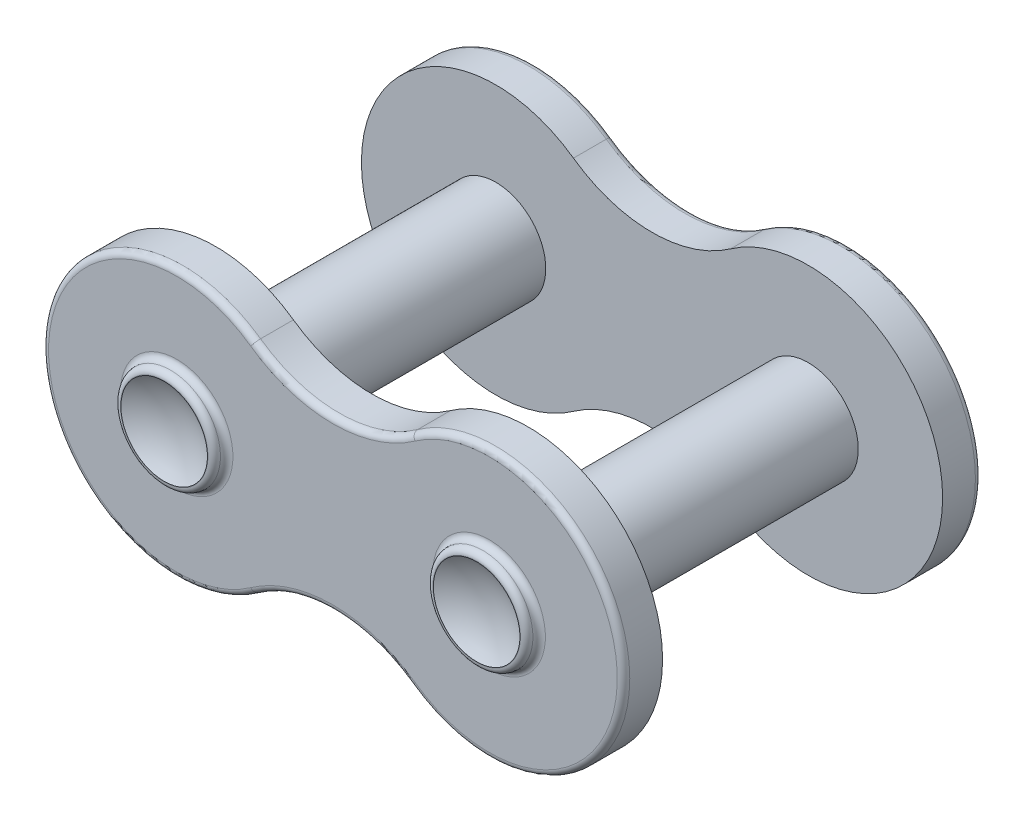
ISO-10303-21;
HEADER;
FILE_DESCRIPTION(('STEP AP214'),'2;1');
FILE_NAME('part.step','',(''),(''),'','','');
FILE_SCHEMA(('AUTOMOTIVE_DESIGN { 1 0 10303 214 1 1 1 1 }'));
ENDSEC;
DATA;
#1=APPLICATION_CONTEXT('core data for automotive mechanical design processes');
#2=APPLICATION_PROTOCOL_DEFINITION('international standard','automotive_design',2000,#1);
#3=PRODUCT_CONTEXT('',#1,'mechanical');
#4=PRODUCT('Part','Part','',(#3));
#5=PRODUCT_RELATED_PRODUCT_CATEGORY('part','',(#4));
#6=PRODUCT_DEFINITION_FORMATION('','',#4);
#7=PRODUCT_DEFINITION_CONTEXT('part definition',#1,'design');
#8=PRODUCT_DEFINITION('design','',#6,#7);
#9=PRODUCT_DEFINITION_SHAPE('','',#8);
#10=(LENGTH_UNIT() NAMED_UNIT(*) SI_UNIT(.MILLI.,.METRE.));
#11=(NAMED_UNIT(*) PLANE_ANGLE_UNIT() SI_UNIT($,.RADIAN.));
#12=(NAMED_UNIT(*) SI_UNIT($,.STERADIAN.) SOLID_ANGLE_UNIT());
#13=UNCERTAINTY_MEASURE_WITH_UNIT(LENGTH_MEASURE(1.E-05),#10,'distance_accuracy_value','');
#14=(GEOMETRIC_REPRESENTATION_CONTEXT(3) GLOBAL_UNCERTAINTY_ASSIGNED_CONTEXT((#13)) GLOBAL_UNIT_ASSIGNED_CONTEXT((#10,
#11,#12)) REPRESENTATION_CONTEXT('',''));
#15=CARTESIAN_POINT('',(0.,0.,0.));
#16=DIRECTION('',(0.,0.,1.));
#17=DIRECTION('',(1.,0.,0.));
#18=AXIS2_PLACEMENT_3D('',#15,#16,#17);
#19=CARTESIAN_POINT('',(3.175,4.48243998170164,1.5875));
#20=DIRECTION('',(0.,0.,1.));
#21=DIRECTION('',(1.,0.,0.));
#22=AXIS2_PLACEMENT_3D('',#19,#20,#21);
#23=PLANE('',#22);
#24=CARTESIAN_POINT('',(6.35,0.,1.5875));
#25=DIRECTION('',(0.,0.,1.));
#26=DIRECTION('',(1.,0.,0.));
#27=AXIS2_PLACEMENT_3D('',#24,#25,#26);
#28=CIRCLE('',#27,2.032);
#29=CARTESIAN_POINT('',(8.382,0.,1.5875));
#30=VERTEX_POINT('',#29);
#31=EDGE_CURVE('E173',#30,#30,#28,.T.);
#32=ORIENTED_EDGE('',*,*,#31,.F.);
#33=EDGE_LOOP('',(#32));
#34=FACE_BOUND('',#33,.T.);
#35=CARTESIAN_POINT('',(0.,8.96487996340328,1.5875));
#36=DIRECTION('',(0.,0.,-1.));
#37=DIRECTION('',(1.,0.,0.));
#38=AXIS2_PLACEMENT_3D('',#35,#36,#37);
#39=CIRCLE('',#38,5.52497163469074);
#40=CARTESIAN_POINT('',(3.19348811801969,4.45633860236373,1.5875));
#41=VERTEX_POINT('',#40);
#42=CARTESIAN_POINT('',(-3.19348811801969,4.45633860236373,1.5875));
#43=VERTEX_POINT('',#42);
#44=EDGE_CURVE('E176',#41,#43,#39,.T.);
#45=ORIENTED_EDGE('',*,*,#44,.T.);
#46=CARTESIAN_POINT('',(-6.35,0.,1.5875));
#47=DIRECTION('',(0.,0.,1.));
#48=DIRECTION('',(-1.,0.,0.));
#49=AXIS2_PLACEMENT_3D('',#46,#47,#48);
#50=CIRCLE('',#49,5.461);
#51=CARTESIAN_POINT('',(-3.19348811801969,-4.45633860236373,1.5875));
#52=VERTEX_POINT('',#51);
#53=EDGE_CURVE('E179',#43,#52,#50,.T.);
#54=ORIENTED_EDGE('',*,*,#53,.T.);
#55=CARTESIAN_POINT('',(0.,-8.96487996340328,1.5875));
#56=DIRECTION('',(0.,0.,-1.));
#57=DIRECTION('',(-1.,0.,0.));
#58=AXIS2_PLACEMENT_3D('',#55,#56,#57);
#59=CIRCLE('',#58,5.52497163469074);
#60=CARTESIAN_POINT('',(3.19348811801968,-4.45633860236373,1.5875));
#61=VERTEX_POINT('',#60);
#62=EDGE_CURVE('E181',#52,#61,#59,.T.);
#63=ORIENTED_EDGE('',*,*,#62,.T.);
#64=CARTESIAN_POINT('',(6.35,0.,1.5875));
#65=DIRECTION('',(0.,0.,1.));
#66=DIRECTION('',(1.,0.,0.));
#67=AXIS2_PLACEMENT_3D('',#64,#65,#66);
#68=CIRCLE('',#67,5.461);
#69=EDGE_CURVE('E183',#61,#41,#68,.T.);
#70=ORIENTED_EDGE('',*,*,#69,.T.);
#71=EDGE_LOOP('',(#45,#54,#63,#70));
#72=FACE_BOUND('',#71,.T.);
#73=CARTESIAN_POINT('',(-6.35,0.,1.5875));
#74=DIRECTION('',(0.,0.,1.));
#75=DIRECTION('',(-1.,0.,0.));
#76=AXIS2_PLACEMENT_3D('',#73,#74,#75);
#77=CIRCLE('',#76,2.032);
#78=CARTESIAN_POINT('',(-8.382,0.,1.5875));
#79=VERTEX_POINT('',#78);
#80=EDGE_CURVE('E146',#79,#79,#77,.T.);
#81=ORIENTED_EDGE('',*,*,#80,.F.);
#82=EDGE_LOOP('',(#81));
#83=FACE_BOUND('',#82,.T.);
#84=ADVANCED_FACE('F46',(#34,#72,#83),#23,.T.);
#85=CARTESIAN_POINT('',(3.175,4.48243998170164,0.));
#86=DIRECTION('',(0.,0.,1.));
#87=DIRECTION('',(1.,0.,0.));
#88=AXIS2_PLACEMENT_3D('',#85,#86,#87);
#89=PLANE('',#88);
#90=CARTESIAN_POINT('',(-6.35,0.,0.));
#91=DIRECTION('',(0.,0.,1.));
#92=DIRECTION('',(1.,0.,0.));
#93=AXIS2_PLACEMENT_3D('',#90,#91,#92);
#94=CIRCLE('',#93,2.286);
#95=CARTESIAN_POINT('',(-4.064,0.,0.));
#96=VERTEX_POINT('',#95);
#97=EDGE_CURVE('E247',#96,#96,#94,.T.);
#98=ORIENTED_EDGE('',*,*,#97,.T.);
#99=EDGE_LOOP('',(#98));
#100=FACE_BOUND('',#99,.T.);
#101=CARTESIAN_POINT('',(6.35,0.,0.));
#102=DIRECTION('',(0.,0.,1.));
#103=DIRECTION('',(1.,0.,0.));
#104=AXIS2_PLACEMENT_3D('',#101,#102,#103);
#105=CIRCLE('',#104,2.286);
#106=CARTESIAN_POINT('',(8.636,0.,0.));
#107=VERTEX_POINT('',#106);
#108=EDGE_CURVE('E244',#107,#107,#105,.T.);
#109=ORIENTED_EDGE('',*,*,#108,.T.);
#110=EDGE_LOOP('',(#109));
#111=FACE_BOUND('',#110,.T.);
#112=CARTESIAN_POINT('',(0.,-8.96487996340328,0.));
#113=DIRECTION('',(0.,0.,1.));
#114=DIRECTION('',(1.,0.,0.));
#115=AXIS2_PLACEMENT_3D('',#112,#113,#114);
#116=CIRCLE('',#115,5.77897163469074);
#117=CARTESIAN_POINT('',(3.3403026241583,-4.24906703946309,0.));
#118=VERTEX_POINT('',#117);
#119=CARTESIAN_POINT('',(-3.34030262415831,-4.24906703946309,0.));
#120=VERTEX_POINT('',#119);
#121=EDGE_CURVE('E239',#118,#120,#116,.T.);
#122=ORIENTED_EDGE('',*,*,#121,.T.);
#123=CARTESIAN_POINT('',(-6.35,0.,0.));
#124=DIRECTION('',(0.,0.,1.));
#125=DIRECTION('',(1.,0.,0.));
#126=AXIS2_PLACEMENT_3D('',#123,#124,#125);
#127=CIRCLE('',#126,5.207);
#128=CARTESIAN_POINT('',(-3.34030262415831,4.24906703946309,0.));
#129=VERTEX_POINT('',#128);
#130=EDGE_CURVE('E241',#120,#129,#127,.F.);
#131=ORIENTED_EDGE('',*,*,#130,.T.);
#132=CARTESIAN_POINT('',(0.,8.96487996340328,0.));
#133=DIRECTION('',(0.,0.,1.));
#134=DIRECTION('',(1.,0.,0.));
#135=AXIS2_PLACEMENT_3D('',#132,#133,#134);
#136=CIRCLE('',#135,5.77897163469074);
#137=CARTESIAN_POINT('',(3.34030262415831,4.24906703946309,0.));
#138=VERTEX_POINT('',#137);
#139=EDGE_CURVE('E235',#129,#138,#136,.T.);
#140=ORIENTED_EDGE('',*,*,#139,.T.);
#141=CARTESIAN_POINT('',(6.35,0.,0.));
#142=DIRECTION('',(0.,0.,1.));
#143=DIRECTION('',(1.,0.,0.));
#144=AXIS2_PLACEMENT_3D('',#141,#142,#143);
#145=CIRCLE('',#144,5.207);
#146=EDGE_CURVE('E237',#138,#118,#145,.F.);
#147=ORIENTED_EDGE('',*,*,#146,.T.);
#148=EDGE_LOOP('',(#122,#131,#140,#147));
#149=FACE_BOUND('',#148,.T.);
#150=ADVANCED_FACE('F323',(#100,#111,#149),#89,.F.);
#151=CARTESIAN_POINT('',(0.,8.96487996340328,1.5875));
#152=DIRECTION('',(0.,0.,-1.));
#153=DIRECTION('',(-1.,0.,0.));
#154=AXIS2_PLACEMENT_3D('',#151,#152,#153);
#155=CYLINDRICAL_SURFACE('',#154,5.52497163469074);
#156=DIRECTION('',(0.,0.,-1.));
#157=VECTOR('',#156,1.);
#158=CARTESIAN_POINT('',(3.19348811801969,4.45633860236373,1.5875));
#159=LINE('',#158,#157);
#160=CARTESIAN_POINT('',(3.19348811801969,4.45633860236373,0.254));
#161=VERTEX_POINT('',#160);
#162=EDGE_CURVE('E185',#41,#161,#159,.T.);
#163=ORIENTED_EDGE('',*,*,#162,.T.);
#164=CARTESIAN_POINT('',(0.,8.96487996340328,0.254));
#165=DIRECTION('',(0.,0.,1.));
#166=DIRECTION('',(1.,0.,0.));
#167=AXIS2_PLACEMENT_3D('',#164,#165,#166);
#168=CIRCLE('',#167,5.52497163469074);
#169=CARTESIAN_POINT('',(-3.19348811801969,4.45633860236373,0.254));
#170=VERTEX_POINT('',#169);
#171=EDGE_CURVE('E257',#161,#170,#168,.F.);
#172=ORIENTED_EDGE('',*,*,#171,.T.);
#173=DIRECTION('',(0.,0.,-1.));
#174=VECTOR('',#173,1.);
#175=CARTESIAN_POINT('',(-3.19348811801969,4.45633860236373,1.5875));
#176=LINE('',#175,#174);
#177=EDGE_CURVE('E194',#43,#170,#176,.T.);
#178=ORIENTED_EDGE('',*,*,#177,.F.);
#179=ORIENTED_EDGE('',*,*,#44,.F.);
#180=EDGE_LOOP('',(#163,#172,#178,#179));
#181=FACE_BOUND('',#180,.T.);
#182=ADVANCED_FACE('F329',(#181),#155,.F.);
#183=CARTESIAN_POINT('',(-6.35,0.,1.5875));
#184=DIRECTION('',(0.,0.,-1.));
#185=DIRECTION('',(-1.,0.,0.));
#186=AXIS2_PLACEMENT_3D('',#183,#184,#185);
#187=CYLINDRICAL_SURFACE('',#186,5.461);
#188=ORIENTED_EDGE('',*,*,#177,.T.);
#189=CARTESIAN_POINT('',(-6.35,0.,0.254));
#190=DIRECTION('',(0.,0.,1.));
#191=DIRECTION('',(1.,0.,0.));
#192=AXIS2_PLACEMENT_3D('',#189,#190,#191);
#193=CIRCLE('',#192,5.461);
#194=CARTESIAN_POINT('',(-3.19348811801969,-4.45633860236373,0.254));
#195=VERTEX_POINT('',#194);
#196=EDGE_CURVE('E250',#170,#195,#193,.T.);
#197=ORIENTED_EDGE('',*,*,#196,.T.);
#198=DIRECTION('',(0.,0.,-1.));
#199=VECTOR('',#198,1.);
#200=CARTESIAN_POINT('',(-3.19348811801969,-4.45633860236373,1.5875));
#201=LINE('',#200,#199);
#202=EDGE_CURVE('E191',#52,#195,#201,.T.);
#203=ORIENTED_EDGE('',*,*,#202,.F.);
#204=ORIENTED_EDGE('',*,*,#53,.F.);
#205=EDGE_LOOP('',(#188,#197,#203,#204));
#206=FACE_BOUND('',#205,.T.);
#207=ADVANCED_FACE('F346',(#206),#187,.T.);
#208=CARTESIAN_POINT('',(0.,-8.96487996340328,1.5875));
#209=DIRECTION('',(0.,0.,-1.));
#210=DIRECTION('',(-1.,0.,0.));
#211=AXIS2_PLACEMENT_3D('',#208,#209,#210);
#212=CYLINDRICAL_SURFACE('',#211,5.52497163469074);
#213=ORIENTED_EDGE('',*,*,#202,.T.);
#214=CARTESIAN_POINT('',(0.,-8.96487996340328,0.254));
#215=DIRECTION('',(0.,0.,1.));
#216=DIRECTION('',(1.,0.,0.));
#217=AXIS2_PLACEMENT_3D('',#214,#215,#216);
#218=CIRCLE('',#217,5.52497163469074);
#219=CARTESIAN_POINT('',(3.19348811801968,-4.45633860236373,0.254));
#220=VERTEX_POINT('',#219);
#221=EDGE_CURVE('E253',#195,#220,#218,.F.);
#222=ORIENTED_EDGE('',*,*,#221,.T.);
#223=DIRECTION('',(0.,0.,-1.));
#224=VECTOR('',#223,1.);
#225=CARTESIAN_POINT('',(3.19348811801968,-4.45633860236373,1.5875));
#226=LINE('',#225,#224);
#227=EDGE_CURVE('E188',#61,#220,#226,.T.);
#228=ORIENTED_EDGE('',*,*,#227,.F.);
#229=ORIENTED_EDGE('',*,*,#62,.F.);
#230=EDGE_LOOP('',(#213,#222,#228,#229));
#231=FACE_BOUND('',#230,.T.);
#232=ADVANCED_FACE('F342',(#231),#212,.F.);
#233=CARTESIAN_POINT('',(6.35,0.,1.5875));
#234=DIRECTION('',(0.,0.,-1.));
#235=DIRECTION('',(-1.,0.,0.));
#236=AXIS2_PLACEMENT_3D('',#233,#234,#235);
#237=CYLINDRICAL_SURFACE('',#236,5.461);
#238=ORIENTED_EDGE('',*,*,#227,.T.);
#239=CARTESIAN_POINT('',(6.35,0.,0.254));
#240=DIRECTION('',(0.,0.,1.));
#241=DIRECTION('',(1.,0.,0.));
#242=AXIS2_PLACEMENT_3D('',#239,#240,#241);
#243=CIRCLE('',#242,5.461);
#244=EDGE_CURVE('E255',#220,#161,#243,.T.);
#245=ORIENTED_EDGE('',*,*,#244,.T.);
#246=ORIENTED_EDGE('',*,*,#162,.F.);
#247=ORIENTED_EDGE('',*,*,#69,.F.);
#248=EDGE_LOOP('',(#238,#245,#246,#247));
#249=FACE_BOUND('',#248,.T.);
#250=ADVANCED_FACE('F338',(#249),#237,.T.);
#251=CARTESIAN_POINT('',(-6.35,0.,-0.508));
#252=DIRECTION('',(0.,0.,-1.));
#253=DIRECTION('',(-1.,0.,0.));
#254=AXIS2_PLACEMENT_3D('',#251,#252,#253);
#255=PLANE('',#254);
#256=CARTESIAN_POINT('',(-6.35,0.,-0.508));
#257=DIRECTION('',(0.,0.,-1.));
#258=DIRECTION('',(-1.,0.,0.));
#259=AXIS2_PLACEMENT_3D('',#256,#257,#258);
#260=CIRCLE('',#259,1.778);
#261=CARTESIAN_POINT('',(-8.128,0.,-0.508));
#262=VERTEX_POINT('',#261);
#263=EDGE_CURVE('E197',#262,#262,#260,.T.);
#264=ORIENTED_EDGE('',*,*,#263,.T.);
#265=EDGE_LOOP('',(#264));
#266=FACE_BOUND('',#265,.T.);
#267=CARTESIAN_POINT('',(-6.35,0.,-0.508));
#268=DIRECTION('',(0.,0.,-1.));
#269=DIRECTION('',(-1.,0.,0.));
#270=AXIS2_PLACEMENT_3D('',#267,#268,#269);
#271=CIRCLE('',#270,1.75976362048998);
#272=CARTESIAN_POINT('',(-8.10976362048998,0.,-0.508));
#273=VERTEX_POINT('',#272);
#274=EDGE_CURVE('E205',#273,#273,#271,.T.);
#275=ORIENTED_EDGE('',*,*,#274,.F.);
#276=EDGE_LOOP('',(#275));
#277=FACE_BOUND('',#276,.T.);
#278=ADVANCED_FACE('F341',(#266,#277),#255,.T.);
#279=CARTESIAN_POINT('',(-6.35,0.,-0.508));
#280=DIRECTION('',(0.,0.,1.));
#281=DIRECTION('',(1.,0.,0.));
#282=AXIS2_PLACEMENT_3D('',#279,#280,#281);
#283=CYLINDRICAL_SURFACE('',#282,2.032);
#284=CARTESIAN_POINT('',(-6.35,0.,12.969748));
#285=DIRECTION('',(0.,0.,1.));
#286=DIRECTION('',(-1.,0.,0.));
#287=AXIS2_PLACEMENT_3D('',#284,#285,#286);
#288=CIRCLE('',#287,2.032);
#289=CARTESIAN_POINT('',(-8.382,0.,12.969748));
#290=VERTEX_POINT('',#289);
#291=EDGE_CURVE('E157',#290,#290,#288,.T.);
#292=ORIENTED_EDGE('',*,*,#291,.F.);
#293=EDGE_LOOP('',(#292));
#294=FACE_BOUND('',#293,.T.);
#295=ORIENTED_EDGE('',*,*,#80,.T.);
#296=EDGE_LOOP('',(#295));
#297=FACE_BOUND('',#296,.T.);
#298=ADVANCED_FACE('F335',(#294,#297),#283,.T.);
#299=CARTESIAN_POINT('',(0.,8.96487996340328,12.969748));
#300=DIRECTION('',(0.,0.,1.));
#301=DIRECTION('',(1.,0.,0.));
#302=AXIS2_PLACEMENT_3D('',#299,#300,#301);
#303=CYLINDRICAL_SURFACE('',#302,5.52497163469074);
#304=DIRECTION('',(0.,0.,1.));
#305=VECTOR('',#304,1.);
#306=CARTESIAN_POINT('',(-3.19348811801969,4.45633860236373,12.969748));
#307=LINE('',#306,#305);
#308=CARTESIAN_POINT('',(-3.19348811801969,4.45633860236373,12.969748));
#309=VERTEX_POINT('',#308);
#310=CARTESIAN_POINT('',(-3.19348811801969,4.45633860236373,14.303248));
#311=VERTEX_POINT('',#310);
#312=EDGE_CURVE('E166',#309,#311,#307,.T.);
#313=ORIENTED_EDGE('',*,*,#312,.T.);
#314=CARTESIAN_POINT('',(0.,8.96487996340328,14.303248));
#315=DIRECTION('',(0.,0.,-1.));
#316=DIRECTION('',(-1.,0.,0.));
#317=AXIS2_PLACEMENT_3D('',#314,#315,#316);
#318=CIRCLE('',#317,5.52497163469074);
#319=CARTESIAN_POINT('',(3.19348811801969,4.45633860236373,14.303248));
#320=VERTEX_POINT('',#319);
#321=EDGE_CURVE('E13',#311,#320,#318,.F.);
#322=ORIENTED_EDGE('',*,*,#321,.T.);
#323=DIRECTION('',(0.,0.,1.));
#324=VECTOR('',#323,1.);
#325=CARTESIAN_POINT('',(3.19348811801969,4.45633860236373,12.969748));
#326=LINE('',#325,#324);
#327=CARTESIAN_POINT('',(3.19348811801969,4.45633860236373,12.969748));
#328=VERTEX_POINT('',#327);
#329=EDGE_CURVE('E136',#328,#320,#326,.T.);
#330=ORIENTED_EDGE('',*,*,#329,.F.);
#331=CARTESIAN_POINT('',(0.,8.96487996340328,12.969748));
#332=DIRECTION('',(0.,0.,-1.));
#333=DIRECTION('',(1.,0.,0.));
#334=AXIS2_PLACEMENT_3D('',#331,#332,#333);
#335=CIRCLE('',#334,5.52497163469074);
#336=EDGE_CURVE('E139',#328,#309,#335,.T.);
#337=ORIENTED_EDGE('',*,*,#336,.T.);
#338=EDGE_LOOP('',(#313,#322,#330,#337));
#339=FACE_BOUND('',#338,.T.);
#340=ADVANCED_FACE('F138',(#339),#303,.F.);
#341=CARTESIAN_POINT('',(6.35,0.,12.969748));
#342=DIRECTION('',(0.,0.,1.));
#343=DIRECTION('',(1.,0.,0.));
#344=AXIS2_PLACEMENT_3D('',#341,#342,#343);
#345=CYLINDRICAL_SURFACE('',#344,5.461);
#346=ORIENTED_EDGE('',*,*,#329,.T.);
#347=CARTESIAN_POINT('',(6.35,0.,14.303248));
#348=DIRECTION('',(0.,0.,-1.));
#349=DIRECTION('',(-1.,0.,0.));
#350=AXIS2_PLACEMENT_3D('',#347,#348,#349);
#351=CIRCLE('',#350,5.461);
#352=CARTESIAN_POINT('',(3.19348811801968,-4.45633860236373,14.303248));
#353=VERTEX_POINT('',#352);
#354=EDGE_CURVE('E274',#320,#353,#351,.T.);
#355=ORIENTED_EDGE('',*,*,#354,.T.);
#356=DIRECTION('',(0.,0.,1.));
#357=VECTOR('',#356,1.);
#358=CARTESIAN_POINT('',(3.19348811801968,-4.45633860236373,12.969748));
#359=LINE('',#358,#357);
#360=CARTESIAN_POINT('',(3.19348811801968,-4.45633860236373,12.969748));
#361=VERTEX_POINT('',#360);
#362=EDGE_CURVE('E147',#361,#353,#359,.T.);
#363=ORIENTED_EDGE('',*,*,#362,.F.);
#364=CARTESIAN_POINT('',(6.35,0.,12.969748));
#365=DIRECTION('',(0.,0.,1.));
#366=DIRECTION('',(1.,0.,0.));
#367=AXIS2_PLACEMENT_3D('',#364,#365,#366);
#368=CIRCLE('',#367,5.461);
#369=EDGE_CURVE('E153',#361,#328,#368,.T.);
#370=ORIENTED_EDGE('',*,*,#369,.T.);
#371=EDGE_LOOP('',(#346,#355,#363,#370));
#372=FACE_BOUND('',#371,.T.);
#373=ADVANCED_FACE('F159',(#372),#345,.T.);
#374=CARTESIAN_POINT('',(0.,-8.96487996340328,12.969748));
#375=DIRECTION('',(0.,0.,1.));
#376=DIRECTION('',(1.,0.,0.));
#377=AXIS2_PLACEMENT_3D('',#374,#375,#376);
#378=CYLINDRICAL_SURFACE('',#377,5.52497163469074);
#379=ORIENTED_EDGE('',*,*,#362,.T.);
#380=CARTESIAN_POINT('',(0.,-8.96487996340328,14.303248));
#381=DIRECTION('',(0.,0.,-1.));
#382=DIRECTION('',(-1.,0.,0.));
#383=AXIS2_PLACEMENT_3D('',#380,#381,#382);
#384=CIRCLE('',#383,5.52497163469074);
#385=CARTESIAN_POINT('',(-3.19348811801969,-4.45633860236373,14.303248));
#386=VERTEX_POINT('',#385);
#387=EDGE_CURVE('E70',#353,#386,#384,.F.);
#388=ORIENTED_EDGE('',*,*,#387,.T.);
#389=DIRECTION('',(0.,0.,1.));
#390=VECTOR('',#389,1.);
#391=CARTESIAN_POINT('',(-3.19348811801969,-4.45633860236373,12.969748));
#392=LINE('',#391,#390);
#393=CARTESIAN_POINT('',(-3.19348811801969,-4.45633860236373,12.969748));
#394=VERTEX_POINT('',#393);
#395=EDGE_CURVE('E168',#394,#386,#392,.T.);
#396=ORIENTED_EDGE('',*,*,#395,.F.);
#397=CARTESIAN_POINT('',(0.,-8.96487996340328,12.969748));
#398=DIRECTION('',(0.,0.,-1.));
#399=DIRECTION('',(-1.,0.,0.));
#400=AXIS2_PLACEMENT_3D('',#397,#398,#399);
#401=CIRCLE('',#400,5.52497163469074);
#402=EDGE_CURVE('E160',#394,#361,#401,.T.);
#403=ORIENTED_EDGE('',*,*,#402,.T.);
#404=EDGE_LOOP('',(#379,#388,#396,#403));
#405=FACE_BOUND('',#404,.T.);
#406=ADVANCED_FACE('F309',(#405),#378,.F.);
#407=CARTESIAN_POINT('',(-6.35,0.,12.969748));
#408=DIRECTION('',(0.,0.,1.));
#409=DIRECTION('',(1.,0.,0.));
#410=AXIS2_PLACEMENT_3D('',#407,#408,#409);
#411=CYLINDRICAL_SURFACE('',#410,5.461);
#412=ORIENTED_EDGE('',*,*,#395,.T.);
#413=CARTESIAN_POINT('',(-6.35,0.,14.303248));
#414=DIRECTION('',(0.,0.,-1.));
#415=DIRECTION('',(-1.,0.,0.));
#416=AXIS2_PLACEMENT_3D('',#413,#414,#415);
#417=CIRCLE('',#416,5.461);
#418=EDGE_CURVE('E55',#386,#311,#417,.T.);
#419=ORIENTED_EDGE('',*,*,#418,.T.);
#420=ORIENTED_EDGE('',*,*,#312,.F.);
#421=CARTESIAN_POINT('',(-6.35,0.,12.969748));
#422=DIRECTION('',(0.,0.,1.));
#423=DIRECTION('',(-1.,0.,0.));
#424=AXIS2_PLACEMENT_3D('',#421,#422,#423);
#425=CIRCLE('',#424,5.461);
#426=EDGE_CURVE('E156',#309,#394,#425,.T.);
#427=ORIENTED_EDGE('',*,*,#426,.T.);
#428=EDGE_LOOP('',(#412,#419,#420,#427));
#429=FACE_BOUND('',#428,.T.);
#430=ADVANCED_FACE('F310',(#429),#411,.T.);
#431=CARTESIAN_POINT('',(3.175,4.48243998170164,12.969748));
#432=DIRECTION('',(0.,0.,-1.));
#433=DIRECTION('',(1.,0.,0.));
#434=AXIS2_PLACEMENT_3D('',#431,#432,#433);
#435=PLANE('',#434);
#436=ORIENTED_EDGE('',*,*,#291,.T.);
#437=EDGE_LOOP('',(#436));
#438=FACE_BOUND('',#437,.T.);
#439=CARTESIAN_POINT('',(6.35,0.,12.969748));
#440=DIRECTION('',(0.,0.,-1.));
#441=DIRECTION('',(-1.,0.,0.));
#442=AXIS2_PLACEMENT_3D('',#439,#440,#441);
#443=CIRCLE('',#442,2.032);
#444=CARTESIAN_POINT('',(4.318,0.,12.969748));
#445=VERTEX_POINT('',#444);
#446=EDGE_CURVE('E201',#445,#445,#443,.T.);
#447=ORIENTED_EDGE('',*,*,#446,.F.);
#448=EDGE_LOOP('',(#447));
#449=FACE_BOUND('',#448,.T.);
#450=ORIENTED_EDGE('',*,*,#336,.F.);
#451=ORIENTED_EDGE('',*,*,#369,.F.);
#452=ORIENTED_EDGE('',*,*,#402,.F.);
#453=ORIENTED_EDGE('',*,*,#426,.F.);
#454=EDGE_LOOP('',(#450,#451,#452,#453));
#455=FACE_BOUND('',#454,.T.);
#456=ADVANCED_FACE('F151',(#438,#449,#455),#435,.T.);
#457=CARTESIAN_POINT('',(3.175,4.48243998170164,14.557248));
#458=DIRECTION('',(0.,0.,-1.));
#459=DIRECTION('',(1.,0.,0.));
#460=AXIS2_PLACEMENT_3D('',#457,#458,#459);
#461=PLANE('',#460);
#462=CARTESIAN_POINT('',(0.,-8.96487996340328,14.557248));
#463=DIRECTION('',(0.,0.,-1.));
#464=DIRECTION('',(-1.,0.,0.));
#465=AXIS2_PLACEMENT_3D('',#462,#463,#464);
#466=CIRCLE('',#465,5.77897163469074);
#467=CARTESIAN_POINT('',(-3.34030262415831,-4.24906703946309,14.557248));
#468=VERTEX_POINT('',#467);
#469=CARTESIAN_POINT('',(3.3403026241583,-4.24906703946309,14.557248));
#470=VERTEX_POINT('',#469);
#471=EDGE_CURVE('E269',#468,#470,#466,.T.);
#472=ORIENTED_EDGE('',*,*,#471,.T.);
#473=CARTESIAN_POINT('',(6.35,0.,14.557248));
#474=DIRECTION('',(0.,0.,-1.));
#475=DIRECTION('',(-1.,0.,0.));
#476=AXIS2_PLACEMENT_3D('',#473,#474,#475);
#477=CIRCLE('',#476,5.207);
#478=CARTESIAN_POINT('',(3.34030262415831,4.24906703946309,14.557248));
#479=VERTEX_POINT('',#478);
#480=EDGE_CURVE('E271',#470,#479,#477,.F.);
#481=ORIENTED_EDGE('',*,*,#480,.T.);
#482=CARTESIAN_POINT('',(0.,8.96487996340328,14.557248));
#483=DIRECTION('',(0.,0.,-1.));
#484=DIRECTION('',(-1.,0.,0.));
#485=AXIS2_PLACEMENT_3D('',#482,#483,#484);
#486=CIRCLE('',#485,5.77897163469074);
#487=CARTESIAN_POINT('',(-3.34030262415831,4.24906703946309,14.557248));
#488=VERTEX_POINT('',#487);
#489=EDGE_CURVE('E265',#479,#488,#486,.T.);
#490=ORIENTED_EDGE('',*,*,#489,.T.);
#491=CARTESIAN_POINT('',(-6.35,0.,14.557248));
#492=DIRECTION('',(0.,0.,-1.));
#493=DIRECTION('',(-1.,0.,0.));
#494=AXIS2_PLACEMENT_3D('',#491,#492,#493);
#495=CIRCLE('',#494,5.207);
#496=EDGE_CURVE('E267',#488,#468,#495,.F.);
#497=ORIENTED_EDGE('',*,*,#496,.T.);
#498=EDGE_LOOP('',(#472,#481,#490,#497));
#499=FACE_BOUND('',#498,.T.);
#500=CARTESIAN_POINT('',(6.35,0.,14.557248));
#501=DIRECTION('',(0.,0.,-1.));
#502=DIRECTION('',(-1.,0.,0.));
#503=AXIS2_PLACEMENT_3D('',#500,#501,#502);
#504=CIRCLE('',#503,2.286);
#505=CARTESIAN_POINT('',(4.064,0.,14.557248));
#506=VERTEX_POINT('',#505);
#507=EDGE_CURVE('E262',#506,#506,#504,.T.);
#508=ORIENTED_EDGE('',*,*,#507,.T.);
#509=EDGE_LOOP('',(#508));
#510=FACE_BOUND('',#509,.T.);
#511=CARTESIAN_POINT('',(-6.35,0.,14.557248));
#512=DIRECTION('',(0.,0.,-1.));
#513=DIRECTION('',(-1.,0.,0.));
#514=AXIS2_PLACEMENT_3D('',#511,#512,#513);
#515=CIRCLE('',#514,2.286);
#516=CARTESIAN_POINT('',(-8.636,0.,14.557248));
#517=VERTEX_POINT('',#516);
#518=EDGE_CURVE('E259',#517,#517,#515,.T.);
#519=ORIENTED_EDGE('',*,*,#518,.T.);
#520=EDGE_LOOP('',(#519));
#521=FACE_BOUND('',#520,.T.);
#522=ADVANCED_FACE('F317',(#499,#510,#521),#461,.F.);
#523=CARTESIAN_POINT('',(-6.35,0.,15.065248));
#524=DIRECTION('',(0.,0.,-1.));
#525=DIRECTION('',(-1.,0.,0.));
#526=AXIS2_PLACEMENT_3D('',#523,#524,#525);
#527=PLANE('',#526);
#528=CARTESIAN_POINT('',(-6.35,0.,15.065248));
#529=DIRECTION('',(0.,0.,-1.));
#530=DIRECTION('',(-1.,0.,0.));
#531=AXIS2_PLACEMENT_3D('',#528,#529,#530);
#532=CIRCLE('',#531,1.778);
#533=CARTESIAN_POINT('',(-8.128,0.,15.065248));
#534=VERTEX_POINT('',#533);
#535=EDGE_CURVE('E232',#534,#534,#532,.F.);
#536=ORIENTED_EDGE('',*,*,#535,.T.);
#537=EDGE_LOOP('',(#536));
#538=FACE_BOUND('',#537,.T.);
#539=CARTESIAN_POINT('',(-6.35,0.,15.065248));
#540=DIRECTION('',(0.,0.,-1.));
#541=DIRECTION('',(-1.,0.,0.));
#542=AXIS2_PLACEMENT_3D('',#539,#540,#541);
#543=CIRCLE('',#542,1.75976362048998);
#544=CARTESIAN_POINT('',(-8.10976362048998,0.,15.065248));
#545=VERTEX_POINT('',#544);
#546=EDGE_CURVE('E198',#545,#545,#543,.T.);
#547=ORIENTED_EDGE('',*,*,#546,.T.);
#548=EDGE_LOOP('',(#547));
#549=FACE_BOUND('',#548,.T.);
#550=ADVANCED_FACE('F442',(#538,#549),#527,.F.);
#551=CARTESIAN_POINT('',(-6.35,0.,17.859248));
#552=DIRECTION('',(0.,0.,-1.));
#553=DIRECTION('',(1.,0.,0.));
#554=AXIS2_PLACEMENT_3D('',#551,#552,#553);
#555=SPHERICAL_SURFACE('',#554,3.302);
#556=ORIENTED_EDGE('',*,*,#546,.F.);
#557=EDGE_LOOP('',(#556));
#558=FACE_BOUND('',#557,.T.);
#559=ADVANCED_FACE('F419',(#558),#555,.F.);
#560=CARTESIAN_POINT('',(6.35,0.,15.065248));
#561=DIRECTION('',(0.,0.,-1.));
#562=DIRECTION('',(1.,0.,0.));
#563=AXIS2_PLACEMENT_3D('',#560,#561,#562);
#564=PLANE('',#563);
#565=CARTESIAN_POINT('',(6.35,0.,15.065248));
#566=DIRECTION('',(0.,0.,-1.));
#567=DIRECTION('',(-1.,0.,0.));
#568=AXIS2_PLACEMENT_3D('',#565,#566,#567);
#569=CIRCLE('',#568,1.778);
#570=CARTESIAN_POINT('',(4.572,0.,15.065248));
#571=VERTEX_POINT('',#570);
#572=EDGE_CURVE('E223',#571,#571,#569,.F.);
#573=ORIENTED_EDGE('',*,*,#572,.T.);
#574=EDGE_LOOP('',(#573));
#575=FACE_BOUND('',#574,.T.);
#576=CARTESIAN_POINT('',(6.35,0.,15.065248));
#577=DIRECTION('',(0.,0.,-1.));
#578=DIRECTION('',(-1.,0.,0.));
#579=AXIS2_PLACEMENT_3D('',#576,#577,#578);
#580=CIRCLE('',#579,1.75976362048998);
#581=CARTESIAN_POINT('',(4.59023637951002,0.,15.065248));
#582=VERTEX_POINT('',#581);
#583=EDGE_CURVE('E202',#582,#582,#580,.T.);
#584=ORIENTED_EDGE('',*,*,#583,.T.);
#585=EDGE_LOOP('',(#584));
#586=FACE_BOUND('',#585,.T.);
#587=ADVANCED_FACE('F415',(#575,#586),#564,.F.);
#588=CARTESIAN_POINT('',(6.35,0.,-0.508));
#589=DIRECTION('',(0.,0.,1.));
#590=DIRECTION('',(1.,0.,0.));
#591=AXIS2_PLACEMENT_3D('',#588,#589,#590);
#592=CYLINDRICAL_SURFACE('',#591,2.032);
#593=ORIENTED_EDGE('',*,*,#31,.T.);
#594=EDGE_LOOP('',(#593));
#595=FACE_BOUND('',#594,.T.);
#596=ORIENTED_EDGE('',*,*,#446,.T.);
#597=EDGE_LOOP('',(#596));
#598=FACE_BOUND('',#597,.T.);
#599=ADVANCED_FACE('F418',(#595,#598),#592,.T.);
#600=CARTESIAN_POINT('',(6.35,0.,-0.508));
#601=DIRECTION('',(0.,0.,-1.));
#602=DIRECTION('',(1.,0.,0.));
#603=AXIS2_PLACEMENT_3D('',#600,#601,#602);
#604=PLANE('',#603);
#605=CARTESIAN_POINT('',(6.35,0.,-0.508));
#606=DIRECTION('',(0.,0.,-1.));
#607=DIRECTION('',(-1.,0.,0.));
#608=AXIS2_PLACEMENT_3D('',#605,#606,#607);
#609=CIRCLE('',#608,1.778);
#610=CARTESIAN_POINT('',(4.572,0.,-0.508));
#611=VERTEX_POINT('',#610);
#612=EDGE_CURVE('E220',#611,#611,#609,.T.);
#613=ORIENTED_EDGE('',*,*,#612,.T.);
#614=EDGE_LOOP('',(#613));
#615=FACE_BOUND('',#614,.T.);
#616=CARTESIAN_POINT('',(6.35,0.,-0.508));
#617=DIRECTION('',(0.,0.,-1.));
#618=DIRECTION('',(-1.,0.,0.));
#619=AXIS2_PLACEMENT_3D('',#616,#617,#618);
#620=CIRCLE('',#619,1.75976362048998);
#621=CARTESIAN_POINT('',(4.59023637951002,0.,-0.508));
#622=VERTEX_POINT('',#621);
#623=EDGE_CURVE('E208',#622,#622,#620,.T.);
#624=ORIENTED_EDGE('',*,*,#623,.F.);
#625=EDGE_LOOP('',(#624));
#626=FACE_BOUND('',#625,.T.);
#627=ADVANCED_FACE('F426',(#615,#626),#604,.T.);
#628=CARTESIAN_POINT('',(6.35,0.,17.859248));
#629=DIRECTION('',(0.,0.,-1.));
#630=DIRECTION('',(-1.,0.,0.));
#631=AXIS2_PLACEMENT_3D('',#628,#629,#630);
#632=SPHERICAL_SURFACE('',#631,3.302);
#633=ORIENTED_EDGE('',*,*,#583,.F.);
#634=EDGE_LOOP('',(#633));
#635=FACE_BOUND('',#634,.T.);
#636=ADVANCED_FACE('F423',(#635),#632,.F.);
#637=CARTESIAN_POINT('',(-6.35,0.,-3.302));
#638=DIRECTION('',(0.,0.,1.));
#639=DIRECTION('',(1.,0.,0.));
#640=AXIS2_PLACEMENT_3D('',#637,#638,#639);
#641=SPHERICAL_SURFACE('',#640,3.302);
#642=ORIENTED_EDGE('',*,*,#274,.T.);
#643=EDGE_LOOP('',(#642));
#644=FACE_BOUND('',#643,.T.);
#645=ADVANCED_FACE('F425',(#644),#641,.F.);
#646=CARTESIAN_POINT('',(6.35,0.,-3.302));
#647=DIRECTION('',(0.,0.,1.));
#648=DIRECTION('',(-1.,0.,0.));
#649=AXIS2_PLACEMENT_3D('',#646,#647,#648);
#650=SPHERICAL_SURFACE('',#649,3.302);
#651=ORIENTED_EDGE('',*,*,#623,.T.);
#652=EDGE_LOOP('',(#651));
#653=FACE_BOUND('',#652,.T.);
#654=ADVANCED_FACE('F358',(#653),#650,.F.);
#655=CARTESIAN_POINT('',(-6.35,0.,-0.254));
#656=DIRECTION('',(0.,0.,-1.));
#657=DIRECTION('',(-1.,0.,0.));
#658=AXIS2_PLACEMENT_3D('',#655,#656,#657);
#659=TOROIDAL_SURFACE('',#658,1.778,0.254);
#660=CARTESIAN_POINT('',(-6.35,0.,-0.254));
#661=DIRECTION('',(0.,0.,-1.));
#662=DIRECTION('',(-1.,0.,0.));
#663=AXIS2_PLACEMENT_3D('',#660,#661,#662);
#664=CIRCLE('',#663,2.032);
#665=CARTESIAN_POINT('',(-8.382,0.,-0.254));
#666=VERTEX_POINT('',#665);
#667=EDGE_CURVE('E214',#666,#666,#664,.F.);
#668=ORIENTED_EDGE('',*,*,#667,.F.);
#669=EDGE_LOOP('',(#668));
#670=FACE_BOUND('',#669,.T.);
#671=ORIENTED_EDGE('',*,*,#263,.F.);
#672=EDGE_LOOP('',(#671));
#673=FACE_BOUND('',#672,.T.);
#674=ADVANCED_FACE('F354',(#670,#673),#659,.T.);
#675=CARTESIAN_POINT('',(6.35,0.,-0.254));
#676=DIRECTION('',(0.,0.,-1.));
#677=DIRECTION('',(-1.,0.,0.));
#678=AXIS2_PLACEMENT_3D('',#675,#676,#677);
#679=TOROIDAL_SURFACE('',#678,1.778,0.254);
#680=ORIENTED_EDGE('',*,*,#612,.F.);
#681=EDGE_LOOP('',(#680));
#682=FACE_BOUND('',#681,.T.);
#683=CARTESIAN_POINT('',(6.35,0.,-0.254));
#684=DIRECTION('',(0.,0.,-1.));
#685=DIRECTION('',(-1.,0.,0.));
#686=AXIS2_PLACEMENT_3D('',#683,#684,#685);
#687=CIRCLE('',#686,2.032);
#688=CARTESIAN_POINT('',(4.318,0.,-0.254));
#689=VERTEX_POINT('',#688);
#690=EDGE_CURVE('E217',#689,#689,#687,.F.);
#691=ORIENTED_EDGE('',*,*,#690,.F.);
#692=EDGE_LOOP('',(#691));
#693=FACE_BOUND('',#692,.T.);
#694=ADVANCED_FACE('F357',(#682,#693),#679,.T.);
#695=CARTESIAN_POINT('',(6.35,0.,14.811248));
#696=DIRECTION('',(0.,0.,-1.));
#697=DIRECTION('',(-1.,0.,0.));
#698=AXIS2_PLACEMENT_3D('',#695,#696,#697);
#699=TOROIDAL_SURFACE('',#698,1.778,0.254);
#700=CARTESIAN_POINT('',(6.35,0.,14.811248));
#701=DIRECTION('',(0.,0.,-1.));
#702=DIRECTION('',(-1.,0.,0.));
#703=AXIS2_PLACEMENT_3D('',#700,#701,#702);
#704=CIRCLE('',#703,2.032);
#705=CARTESIAN_POINT('',(4.318,0.,14.811248));
#706=VERTEX_POINT('',#705);
#707=EDGE_CURVE('E226',#706,#706,#704,.T.);
#708=ORIENTED_EDGE('',*,*,#707,.F.);
#709=EDGE_LOOP('',(#708));
#710=FACE_BOUND('',#709,.T.);
#711=ORIENTED_EDGE('',*,*,#572,.F.);
#712=EDGE_LOOP('',(#711));
#713=FACE_BOUND('',#712,.T.);
#714=ADVANCED_FACE('F362',(#710,#713),#699,.T.);
#715=CARTESIAN_POINT('',(-6.35,0.,14.811248));
#716=DIRECTION('',(0.,0.,-1.));
#717=DIRECTION('',(-1.,0.,0.));
#718=AXIS2_PLACEMENT_3D('',#715,#716,#717);
#719=TOROIDAL_SURFACE('',#718,1.778,0.254);
#720=ORIENTED_EDGE('',*,*,#535,.F.);
#721=EDGE_LOOP('',(#720));
#722=FACE_BOUND('',#721,.T.);
#723=CARTESIAN_POINT('',(-6.35,0.,14.811248));
#724=DIRECTION('',(0.,0.,-1.));
#725=DIRECTION('',(-1.,0.,0.));
#726=AXIS2_PLACEMENT_3D('',#723,#724,#725);
#727=CIRCLE('',#726,2.032);
#728=CARTESIAN_POINT('',(-8.382,0.,14.811248));
#729=VERTEX_POINT('',#728);
#730=EDGE_CURVE('E229',#729,#729,#727,.T.);
#731=ORIENTED_EDGE('',*,*,#730,.F.);
#732=EDGE_LOOP('',(#731));
#733=FACE_BOUND('',#732,.T.);
#734=ADVANCED_FACE('F366',(#722,#733),#719,.T.);
#735=CARTESIAN_POINT('',(-6.35,0.,-0.254));
#736=DIRECTION('',(0.,0.,1.));
#737=DIRECTION('',(1.,0.,0.));
#738=AXIS2_PLACEMENT_3D('',#735,#736,#737);
#739=TOROIDAL_SURFACE('',#738,2.286,0.254);
#740=ORIENTED_EDGE('',*,*,#97,.F.);
#741=EDGE_LOOP('',(#740));
#742=FACE_BOUND('',#741,.T.);
#743=ORIENTED_EDGE('',*,*,#667,.T.);
#744=EDGE_LOOP('',(#743));
#745=FACE_BOUND('',#744,.T.);
#746=ADVANCED_FACE('F370',(#742,#745),#739,.F.);
#747=CARTESIAN_POINT('',(6.35,0.,-0.254));
#748=DIRECTION('',(0.,0.,1.));
#749=DIRECTION('',(1.,0.,0.));
#750=AXIS2_PLACEMENT_3D('',#747,#748,#749);
#751=TOROIDAL_SURFACE('',#750,2.286,0.254);
#752=ORIENTED_EDGE('',*,*,#690,.T.);
#753=EDGE_LOOP('',(#752));
#754=FACE_BOUND('',#753,.T.);
#755=ORIENTED_EDGE('',*,*,#108,.F.);
#756=EDGE_LOOP('',(#755));
#757=FACE_BOUND('',#756,.T.);
#758=ADVANCED_FACE('F374',(#754,#757),#751,.F.);
#759=CARTESIAN_POINT('',(6.35,0.,0.254));
#760=DIRECTION('',(0.,0.,1.));
#761=DIRECTION('',(1.,0.,0.));
#762=AXIS2_PLACEMENT_3D('',#759,#760,#761);
#763=TOROIDAL_SURFACE('',#762,5.207,0.254);
#764=CARTESIAN_POINT('',(3.3403026241583,-4.24906703946309,0.254));
#765=DIRECTION('',(-0.816029775199364,0.578009866687477,0.));
#766=DIRECTION('',(-0.578009866687477,-0.816029775199364,0.));
#767=AXIS2_PLACEMENT_3D('',#764,#765,#766);
#768=CIRCLE('',#767,0.254);
#769=EDGE_CURVE('E282',#118,#220,#768,.T.);
#770=ORIENTED_EDGE('',*,*,#769,.F.);
#771=ORIENTED_EDGE('',*,*,#146,.F.);
#772=CARTESIAN_POINT('',(3.34030262415831,4.24906703946309,0.254));
#773=DIRECTION('',(-0.816029775199364,-0.578009866687477,0.));
#774=DIRECTION('',(0.578009866687477,-0.816029775199364,0.));
#775=AXIS2_PLACEMENT_3D('',#772,#773,#774);
#776=CIRCLE('',#775,0.254);
#777=EDGE_CURVE('E211',#161,#138,#776,.T.);
#778=ORIENTED_EDGE('',*,*,#777,.F.);
#779=ORIENTED_EDGE('',*,*,#244,.F.);
#780=EDGE_LOOP('',(#770,#771,#778,#779));
#781=FACE_BOUND('',#780,.T.);
#782=ADVANCED_FACE('F378',(#781),#763,.T.);
#783=CARTESIAN_POINT('',(0.,8.96487996340328,0.254));
#784=DIRECTION('',(0.,0.,1.));
#785=DIRECTION('',(1.,0.,0.));
#786=AXIS2_PLACEMENT_3D('',#783,#784,#785);
#787=TOROIDAL_SURFACE('',#786,5.77897163469074,0.254);
#788=ORIENTED_EDGE('',*,*,#777,.T.);
#789=ORIENTED_EDGE('',*,*,#139,.F.);
#790=CARTESIAN_POINT('',(-3.34030262415831,4.24906703946309,0.254));
#791=DIRECTION('',(-0.816029775199364,0.578009866687477,0.));
#792=DIRECTION('',(-0.578009866687477,-0.816029775199364,0.));
#793=AXIS2_PLACEMENT_3D('',#790,#791,#792);
#794=CIRCLE('',#793,0.254);
#795=EDGE_CURVE('E280',#170,#129,#794,.T.);
#796=ORIENTED_EDGE('',*,*,#795,.F.);
#797=ORIENTED_EDGE('',*,*,#171,.F.);
#798=EDGE_LOOP('',(#788,#789,#796,#797));
#799=FACE_BOUND('',#798,.T.);
#800=ADVANCED_FACE('F387',(#799),#787,.T.);
#801=CARTESIAN_POINT('',(0.,-8.96487996340328,0.254));
#802=DIRECTION('',(0.,0.,1.));
#803=DIRECTION('',(1.,0.,0.));
#804=AXIS2_PLACEMENT_3D('',#801,#802,#803);
#805=TOROIDAL_SURFACE('',#804,5.77897163469074,0.254);
#806=ORIENTED_EDGE('',*,*,#769,.T.);
#807=ORIENTED_EDGE('',*,*,#221,.F.);
#808=CARTESIAN_POINT('',(-3.34030262415831,-4.24906703946309,0.254));
#809=DIRECTION('',(-0.816029775199364,-0.578009866687477,0.));
#810=DIRECTION('',(0.578009866687477,-0.816029775199364,0.));
#811=AXIS2_PLACEMENT_3D('',#808,#809,#810);
#812=CIRCLE('',#811,0.254);
#813=EDGE_CURVE('E278',#120,#195,#812,.T.);
#814=ORIENTED_EDGE('',*,*,#813,.F.);
#815=ORIENTED_EDGE('',*,*,#121,.F.);
#816=EDGE_LOOP('',(#806,#807,#814,#815));
#817=FACE_BOUND('',#816,.T.);
#818=ADVANCED_FACE('F383',(#817),#805,.T.);
#819=CARTESIAN_POINT('',(-6.35,0.,0.254));
#820=DIRECTION('',(0.,0.,1.));
#821=DIRECTION('',(1.,0.,0.));
#822=AXIS2_PLACEMENT_3D('',#819,#820,#821);
#823=TOROIDAL_SURFACE('',#822,5.207,0.254);
#824=ORIENTED_EDGE('',*,*,#795,.T.);
#825=ORIENTED_EDGE('',*,*,#130,.F.);
#826=ORIENTED_EDGE('',*,*,#813,.T.);
#827=ORIENTED_EDGE('',*,*,#196,.F.);
#828=EDGE_LOOP('',(#824,#825,#826,#827));
#829=FACE_BOUND('',#828,.T.);
#830=ADVANCED_FACE('F380',(#829),#823,.T.);
#831=CARTESIAN_POINT('',(-6.35,0.,14.303248));
#832=DIRECTION('',(0.,0.,-1.));
#833=DIRECTION('',(-1.,0.,0.));
#834=AXIS2_PLACEMENT_3D('',#831,#832,#833);
#835=TOROIDAL_SURFACE('',#834,5.207,0.254);
#836=CARTESIAN_POINT('',(-3.34030262415831,4.24906703946309,14.303248));
#837=DIRECTION('',(0.816029775199364,-0.578009866687477,0.));
#838=DIRECTION('',(0.578009866687477,0.816029775199364,0.));
#839=AXIS2_PLACEMENT_3D('',#836,#837,#838);
#840=CIRCLE('',#839,0.254);
#841=EDGE_CURVE('E290',#311,#488,#840,.T.);
#842=ORIENTED_EDGE('',*,*,#841,.F.);
#843=ORIENTED_EDGE('',*,*,#418,.F.);
#844=CARTESIAN_POINT('',(-3.34030262415831,-4.24906703946309,14.303248));
#845=DIRECTION('',(0.816029775199365,0.578009866687476,0.));
#846=DIRECTION('',(-0.578009866687476,0.816029775199365,0.));
#847=AXIS2_PLACEMENT_3D('',#844,#845,#846);
#848=CIRCLE('',#847,0.254);
#849=EDGE_CURVE('E50',#468,#386,#848,.T.);
#850=ORIENTED_EDGE('',*,*,#849,.F.);
#851=ORIENTED_EDGE('',*,*,#496,.F.);
#852=EDGE_LOOP('',(#842,#843,#850,#851));
#853=FACE_BOUND('',#852,.T.);
#854=ADVANCED_FACE('F303',(#853),#835,.T.);
#855=CARTESIAN_POINT('',(0.,-8.96487996340328,14.303248));
#856=DIRECTION('',(0.,0.,-1.));
#857=DIRECTION('',(-1.,0.,0.));
#858=AXIS2_PLACEMENT_3D('',#855,#856,#857);
#859=TOROIDAL_SURFACE('',#858,5.77897163469074,0.254);
#860=ORIENTED_EDGE('',*,*,#849,.T.);
#861=ORIENTED_EDGE('',*,*,#387,.F.);
#862=CARTESIAN_POINT('',(3.3403026241583,-4.24906703946309,14.303248));
#863=DIRECTION('',(0.816029775199364,-0.578009866687477,0.));
#864=DIRECTION('',(0.578009866687477,0.816029775199364,0.));
#865=AXIS2_PLACEMENT_3D('',#862,#863,#864);
#866=CIRCLE('',#865,0.254);
#867=EDGE_CURVE('E289',#470,#353,#866,.T.);
#868=ORIENTED_EDGE('',*,*,#867,.F.);
#869=ORIENTED_EDGE('',*,*,#471,.F.);
#870=EDGE_LOOP('',(#860,#861,#868,#869));
#871=FACE_BOUND('',#870,.T.);
#872=ADVANCED_FACE('F299',(#871),#859,.T.);
#873=CARTESIAN_POINT('',(0.,8.96487996340328,14.303248));
#874=DIRECTION('',(0.,0.,-1.));
#875=DIRECTION('',(-1.,0.,0.));
#876=AXIS2_PLACEMENT_3D('',#873,#874,#875);
#877=TOROIDAL_SURFACE('',#876,5.77897163469074,0.254);
#878=ORIENTED_EDGE('',*,*,#841,.T.);
#879=ORIENTED_EDGE('',*,*,#489,.F.);
#880=CARTESIAN_POINT('',(3.34030262415831,4.24906703946309,14.303248));
#881=DIRECTION('',(0.816029775199364,0.578009866687477,0.));
#882=DIRECTION('',(-0.578009866687477,0.816029775199364,0.));
#883=AXIS2_PLACEMENT_3D('',#880,#881,#882);
#884=CIRCLE('',#883,0.254);
#885=EDGE_CURVE('E287',#320,#479,#884,.T.);
#886=ORIENTED_EDGE('',*,*,#885,.F.);
#887=ORIENTED_EDGE('',*,*,#321,.F.);
#888=EDGE_LOOP('',(#878,#879,#886,#887));
#889=FACE_BOUND('',#888,.T.);
#890=ADVANCED_FACE('F305',(#889),#877,.T.);
#891=CARTESIAN_POINT('',(6.35,0.,14.303248));
#892=DIRECTION('',(0.,0.,-1.));
#893=DIRECTION('',(-1.,0.,0.));
#894=AXIS2_PLACEMENT_3D('',#891,#892,#893);
#895=TOROIDAL_SURFACE('',#894,5.207,0.254);
#896=ORIENTED_EDGE('',*,*,#867,.T.);
#897=ORIENTED_EDGE('',*,*,#354,.F.);
#898=ORIENTED_EDGE('',*,*,#885,.T.);
#899=ORIENTED_EDGE('',*,*,#480,.F.);
#900=EDGE_LOOP('',(#896,#897,#898,#899));
#901=FACE_BOUND('',#900,.T.);
#902=ADVANCED_FACE('F308',(#901),#895,.T.);
#903=CARTESIAN_POINT('',(6.35,0.,14.811248));
#904=DIRECTION('',(0.,0.,-1.));
#905=DIRECTION('',(-1.,0.,0.));
#906=AXIS2_PLACEMENT_3D('',#903,#904,#905);
#907=TOROIDAL_SURFACE('',#906,2.286,0.254);
#908=ORIENTED_EDGE('',*,*,#507,.F.);
#909=EDGE_LOOP('',(#908));
#910=FACE_BOUND('',#909,.T.);
#911=ORIENTED_EDGE('',*,*,#707,.T.);
#912=EDGE_LOOP('',(#911));
#913=FACE_BOUND('',#912,.T.);
#914=ADVANCED_FACE('F397',(#910,#913),#907,.F.);
#915=CARTESIAN_POINT('',(-6.35,0.,14.811248));
#916=DIRECTION('',(0.,0.,-1.));
#917=DIRECTION('',(-1.,0.,0.));
#918=AXIS2_PLACEMENT_3D('',#915,#916,#917);
#919=TOROIDAL_SURFACE('',#918,2.286,0.254);
#920=ORIENTED_EDGE('',*,*,#730,.T.);
#921=EDGE_LOOP('',(#920));
#922=FACE_BOUND('',#921,.T.);
#923=ORIENTED_EDGE('',*,*,#518,.F.);
#924=EDGE_LOOP('',(#923));
#925=FACE_BOUND('',#924,.T.);
#926=ADVANCED_FACE('F48',(#922,#925),#919,.F.);
#927=CLOSED_SHELL('',(#84,#150,#182,#207,#232,#250,#278,#298,#340,#373,#406,#430,#456,#522,#550,
#559,#587,#599,#627,#636,#645,#654,#674,#694,#714,#734,#746,#758,#782,#800,#818,#830,#854,#872,
#890,#902,#914,#926));
#928=MANIFOLD_SOLID_BREP('B2',#927);
#929=ADVANCED_BREP_SHAPE_REPRESENTATION('',(#18,#928),#14);
#930=SHAPE_DEFINITION_REPRESENTATION(#9,#929);
ENDSEC;
END-ISO-10303-21;
